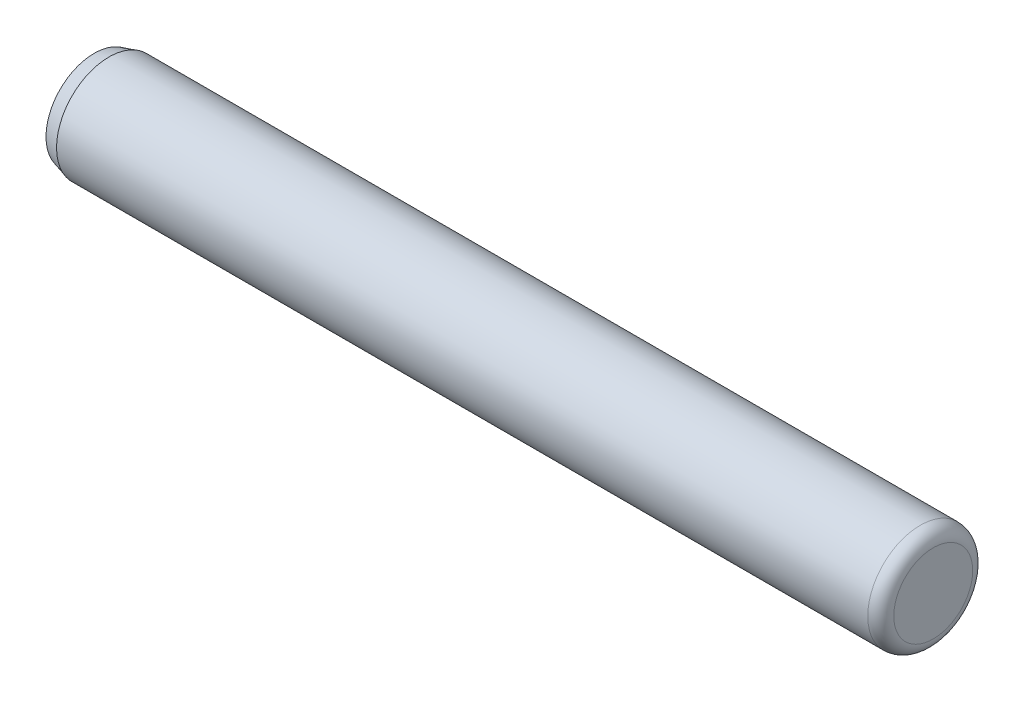
ISO-10303-21;
HEADER;
FILE_DESCRIPTION(('STEP AP214'),'2;1');
FILE_NAME('part.step','',(''),(''),'','','');
FILE_SCHEMA(('AUTOMOTIVE_DESIGN { 1 0 10303 214 1 1 1 1 }'));
ENDSEC;
DATA;
#1=APPLICATION_CONTEXT('core data for automotive mechanical design processes');
#2=APPLICATION_PROTOCOL_DEFINITION('international standard','automotive_design',2000,#1);
#3=PRODUCT_CONTEXT('',#1,'mechanical');
#4=PRODUCT('Part','Part','',(#3));
#5=PRODUCT_RELATED_PRODUCT_CATEGORY('part','',(#4));
#6=PRODUCT_DEFINITION_FORMATION('','',#4);
#7=PRODUCT_DEFINITION_CONTEXT('part definition',#1,'design');
#8=PRODUCT_DEFINITION('design','',#6,#7);
#9=PRODUCT_DEFINITION_SHAPE('','',#8);
#10=(LENGTH_UNIT() NAMED_UNIT(*) SI_UNIT(.MILLI.,.METRE.));
#11=(NAMED_UNIT(*) PLANE_ANGLE_UNIT() SI_UNIT($,.RADIAN.));
#12=(NAMED_UNIT(*) SI_UNIT($,.STERADIAN.) SOLID_ANGLE_UNIT());
#13=UNCERTAINTY_MEASURE_WITH_UNIT(LENGTH_MEASURE(1.E-05),#10,'distance_accuracy_value','');
#14=(GEOMETRIC_REPRESENTATION_CONTEXT(3) GLOBAL_UNCERTAINTY_ASSIGNED_CONTEXT((#13)) GLOBAL_UNIT_ASSIGNED_CONTEXT((#10,
#11,#12)) REPRESENTATION_CONTEXT('',''));
#15=CARTESIAN_POINT('',(0.,0.,0.));
#16=DIRECTION('',(0.,0.,1.));
#17=DIRECTION('',(1.,0.,0.));
#18=AXIS2_PLACEMENT_3D('',#15,#16,#17);
#19=CARTESIAN_POINT('',(24.6126,0.,0.));
#20=DIRECTION('',(-1.,0.,0.));
#21=DIRECTION('',(0.,0.,1.));
#22=AXIS2_PLACEMENT_3D('',#19,#20,#21);
#23=TOROIDAL_SURFACE('',#22,2.39014,0.7874);
#24=CARTESIAN_POINT('',(24.6126,0.,0.));
#25=DIRECTION('',(-1.,0.,0.));
#26=DIRECTION('',(0.,0.,1.));
#27=AXIS2_PLACEMENT_3D('',#24,#25,#26);
#28=CIRCLE('',#27,3.17754);
#29=CARTESIAN_POINT('',(24.6126,0.,3.17754));
#30=VERTEX_POINT('',#29);
#31=EDGE_CURVE('E10',#30,#30,#28,.T.);
#32=ORIENTED_EDGE('',*,*,#31,.F.);
#33=EDGE_LOOP('',(#32));
#34=FACE_BOUND('',#33,.T.);
#35=CARTESIAN_POINT('',(25.4,0.,0.));
#36=DIRECTION('',(-1.,0.,0.));
#37=DIRECTION('',(0.,0.,1.));
#38=AXIS2_PLACEMENT_3D('',#35,#36,#37);
#39=CIRCLE('',#38,2.39014);
#40=CARTESIAN_POINT('',(25.4,0.,2.39014));
#41=VERTEX_POINT('',#40);
#42=EDGE_CURVE('E44',#41,#41,#39,.T.);
#43=ORIENTED_EDGE('',*,*,#42,.T.);
#44=EDGE_LOOP('',(#43));
#45=FACE_BOUND('',#44,.T.);
#46=ADVANCED_FACE('F30',(#34,#45),#23,.T.);
#47=CARTESIAN_POINT('',(-25.4,0.,0.));
#48=DIRECTION('',(-1.,0.,0.));
#49=DIRECTION('',(0.,0.,1.));
#50=AXIS2_PLACEMENT_3D('',#47,#48,#49);
#51=CYLINDRICAL_SURFACE('',#50,3.17754);
#52=CARTESIAN_POINT('',(-24.5053386985771,0.,0.));
#53=DIRECTION('',(-1.,0.,0.));
#54=DIRECTION('',(0.,0.,1.));
#55=AXIS2_PLACEMENT_3D('',#52,#53,#54);
#56=CIRCLE('',#55,3.17754);
#57=CARTESIAN_POINT('',(-24.5053386985771,0.,3.17754));
#58=VERTEX_POINT('',#57);
#59=EDGE_CURVE('E36',#58,#58,#56,.T.);
#60=ORIENTED_EDGE('',*,*,#59,.F.);
#61=EDGE_LOOP('',(#60));
#62=FACE_BOUND('',#61,.T.);
#63=ORIENTED_EDGE('',*,*,#31,.T.);
#64=EDGE_LOOP('',(#63));
#65=FACE_BOUND('',#64,.T.);
#66=ADVANCED_FACE('F62',(#62,#65),#51,.T.);
#67=CARTESIAN_POINT('',(-24.5053386985771,0.,0.));
#68=DIRECTION('',(1.,0.,0.));
#69=DIRECTION('',(0.,0.,-1.));
#70=AXIS2_PLACEMENT_3D('',#67,#68,#69);
#71=CONICAL_SURFACE('',#70,3.17754,0.279252680319092);
#72=CARTESIAN_POINT('',(-25.4,0.,0.));
#73=DIRECTION('',(-1.,0.,0.));
#74=DIRECTION('',(0.,0.,1.));
#75=AXIS2_PLACEMENT_3D('',#72,#73,#74);
#76=CIRCLE('',#75,2.921);
#77=CARTESIAN_POINT('',(-25.4,0.,2.921));
#78=VERTEX_POINT('',#77);
#79=EDGE_CURVE('E40',#78,#78,#76,.T.);
#80=ORIENTED_EDGE('',*,*,#79,.F.);
#81=EDGE_LOOP('',(#80));
#82=FACE_BOUND('',#81,.T.);
#83=ORIENTED_EDGE('',*,*,#59,.T.);
#84=EDGE_LOOP('',(#83));
#85=FACE_BOUND('',#84,.T.);
#86=ADVANCED_FACE('F58',(#82,#85),#71,.T.);
#87=CARTESIAN_POINT('',(-25.4,2.921,0.));
#88=DIRECTION('',(1.,0.,0.));
#89=DIRECTION('',(0.,0.,-1.));
#90=AXIS2_PLACEMENT_3D('',#87,#88,#89);
#91=PLANE('',#90);
#92=ORIENTED_EDGE('',*,*,#79,.T.);
#93=EDGE_LOOP('',(#92));
#94=FACE_BOUND('',#93,.T.);
#95=ADVANCED_FACE('F53',(#94),#91,.F.);
#96=CARTESIAN_POINT('',(25.4,2.39014,0.));
#97=DIRECTION('',(-1.,0.,0.));
#98=DIRECTION('',(0.,0.,1.));
#99=AXIS2_PLACEMENT_3D('',#96,#97,#98);
#100=PLANE('',#99);
#101=ORIENTED_EDGE('',*,*,#42,.F.);
#102=EDGE_LOOP('',(#101));
#103=FACE_BOUND('',#102,.T.);
#104=ADVANCED_FACE('F51',(#103),#100,.F.);
#105=CLOSED_SHELL('',(#46,#66,#86,#95,#104));
#106=MANIFOLD_SOLID_BREP('B2',#105);
#107=ADVANCED_BREP_SHAPE_REPRESENTATION('',(#18,#106),#14);
#108=SHAPE_DEFINITION_REPRESENTATION(#9,#107);
ENDSEC;
END-ISO-10303-21;
